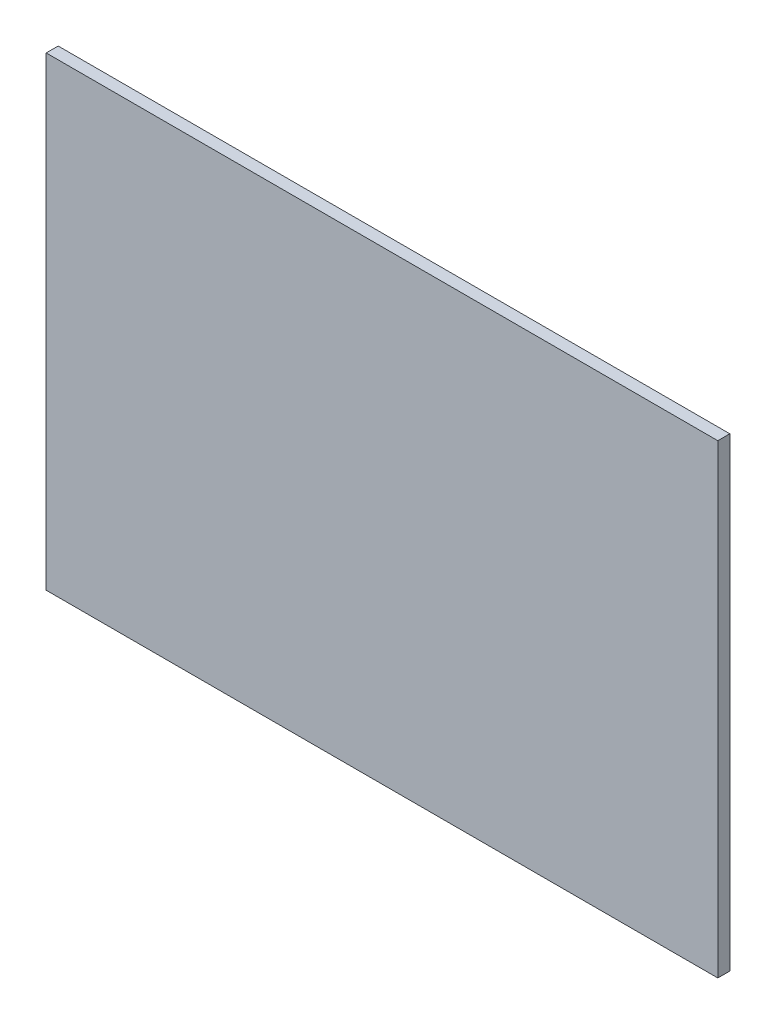
ISO-10303-21;
HEADER;
FILE_DESCRIPTION(('STEP AP214'),'2;1');
FILE_NAME('part.step','',(''),(''),'','','');
FILE_SCHEMA(('AUTOMOTIVE_DESIGN { 1 0 10303 214 1 1 1 1 }'));
ENDSEC;
DATA;
#1=APPLICATION_CONTEXT('core data for automotive mechanical design processes');
#2=APPLICATION_PROTOCOL_DEFINITION('international standard','automotive_design',2000,#1);
#3=PRODUCT_CONTEXT('',#1,'mechanical');
#4=PRODUCT('Part','Part','',(#3));
#5=PRODUCT_RELATED_PRODUCT_CATEGORY('part','',(#4));
#6=PRODUCT_DEFINITION_FORMATION('','',#4);
#7=PRODUCT_DEFINITION_CONTEXT('part definition',#1,'design');
#8=PRODUCT_DEFINITION('design','',#6,#7);
#9=PRODUCT_DEFINITION_SHAPE('','',#8);
#10=(LENGTH_UNIT() NAMED_UNIT(*) SI_UNIT(.MILLI.,.METRE.));
#11=(NAMED_UNIT(*) PLANE_ANGLE_UNIT() SI_UNIT($,.RADIAN.));
#12=(NAMED_UNIT(*) SI_UNIT($,.STERADIAN.) SOLID_ANGLE_UNIT());
#13=UNCERTAINTY_MEASURE_WITH_UNIT(LENGTH_MEASURE(1.E-05),#10,'distance_accuracy_value','');
#14=(GEOMETRIC_REPRESENTATION_CONTEXT(3) GLOBAL_UNCERTAINTY_ASSIGNED_CONTEXT((#13)) GLOBAL_UNIT_ASSIGNED_CONTEXT((#10,
#11,#12)) REPRESENTATION_CONTEXT('',''));
#15=CARTESIAN_POINT('',(0.,0.,0.));
#16=DIRECTION('',(0.,0.,1.));
#17=DIRECTION('',(1.,0.,0.));
#18=AXIS2_PLACEMENT_3D('',#15,#16,#17);
#19=CARTESIAN_POINT('',(0.,0.,3.175));
#20=DIRECTION('',(1.,0.,0.));
#21=DIRECTION('',(0.,0.,-1.));
#22=AXIS2_PLACEMENT_3D('',#19,#20,#21);
#23=PLANE('',#22);
#24=DIRECTION('',(0.,-1.,0.));
#25=VECTOR('',#24,1.);
#26=CARTESIAN_POINT('',(0.,0.,0.));
#27=LINE('',#26,#25);
#28=CARTESIAN_POINT('',(0.,123.19,0.));
#29=VERTEX_POINT('',#28);
#30=CARTESIAN_POINT('',(0.,0.,0.));
#31=VERTEX_POINT('',#30);
#32=EDGE_CURVE('E104',#29,#31,#27,.T.);
#33=ORIENTED_EDGE('',*,*,#32,.T.);
#34=DIRECTION('',(0.,0.,-1.));
#35=VECTOR('',#34,1.);
#36=CARTESIAN_POINT('',(0.,0.,3.175));
#37=LINE('',#36,#35);
#38=CARTESIAN_POINT('',(0.,0.,3.175));
#39=VERTEX_POINT('',#38);
#40=EDGE_CURVE('E11',#39,#31,#37,.T.);
#41=ORIENTED_EDGE('',*,*,#40,.F.);
#42=DIRECTION('',(0.,-1.,0.));
#43=VECTOR('',#42,1.);
#44=CARTESIAN_POINT('',(0.,0.,3.175));
#45=LINE('',#44,#43);
#46=CARTESIAN_POINT('',(0.,123.19,3.175));
#47=VERTEX_POINT('',#46);
#48=EDGE_CURVE('E92',#47,#39,#45,.T.);
#49=ORIENTED_EDGE('',*,*,#48,.F.);
#50=DIRECTION('',(0.,0.,-1.));
#51=VECTOR('',#50,1.);
#52=CARTESIAN_POINT('',(0.,123.19,3.175));
#53=LINE('',#52,#51);
#54=EDGE_CURVE('E100',#47,#29,#53,.T.);
#55=ORIENTED_EDGE('',*,*,#54,.T.);
#56=EDGE_LOOP('',(#33,#41,#49,#55));
#57=FACE_BOUND('',#56,.T.);
#58=ADVANCED_FACE('F41',(#57),#23,.F.);
#59=CARTESIAN_POINT('',(0.,0.,3.175));
#60=DIRECTION('',(0.,1.,0.));
#61=DIRECTION('',(0.,0.,1.));
#62=AXIS2_PLACEMENT_3D('',#59,#60,#61);
#63=PLANE('',#62);
#64=DIRECTION('',(1.,0.,0.));
#65=VECTOR('',#64,1.);
#66=CARTESIAN_POINT('',(0.,0.,0.));
#67=LINE('',#66,#65);
#68=CARTESIAN_POINT('',(177.8,0.,0.));
#69=VERTEX_POINT('',#68);
#70=EDGE_CURVE('E96',#31,#69,#67,.T.);
#71=ORIENTED_EDGE('',*,*,#70,.T.);
#72=DIRECTION('',(0.,0.,-1.));
#73=VECTOR('',#72,1.);
#74=CARTESIAN_POINT('',(177.8,0.,3.175));
#75=LINE('',#74,#73);
#76=CARTESIAN_POINT('',(177.8,0.,3.175));
#77=VERTEX_POINT('',#76);
#78=EDGE_CURVE('E49',#77,#69,#75,.T.);
#79=ORIENTED_EDGE('',*,*,#78,.F.);
#80=DIRECTION('',(1.,0.,0.));
#81=VECTOR('',#80,1.);
#82=CARTESIAN_POINT('',(0.,0.,3.175));
#83=LINE('',#82,#81);
#84=EDGE_CURVE('E87',#39,#77,#83,.T.);
#85=ORIENTED_EDGE('',*,*,#84,.F.);
#86=ORIENTED_EDGE('',*,*,#40,.T.);
#87=EDGE_LOOP('',(#71,#79,#85,#86));
#88=FACE_BOUND('',#87,.T.);
#89=ADVANCED_FACE('F95',(#88),#63,.F.);
#90=CARTESIAN_POINT('',(177.8,0.,3.175));
#91=DIRECTION('',(-1.,0.,0.));
#92=DIRECTION('',(0.,0.,1.));
#93=AXIS2_PLACEMENT_3D('',#90,#91,#92);
#94=PLANE('',#93);
#95=DIRECTION('',(0.,1.,0.));
#96=VECTOR('',#95,1.);
#97=CARTESIAN_POINT('',(177.8,0.,0.));
#98=LINE('',#97,#96);
#99=CARTESIAN_POINT('',(177.8,123.19,0.));
#100=VERTEX_POINT('',#99);
#101=EDGE_CURVE('E74',#69,#100,#98,.T.);
#102=ORIENTED_EDGE('',*,*,#101,.T.);
#103=DIRECTION('',(0.,0.,-1.));
#104=VECTOR('',#103,1.);
#105=CARTESIAN_POINT('',(177.8,123.19,3.175));
#106=LINE('',#105,#104);
#107=CARTESIAN_POINT('',(177.8,123.19,3.175));
#108=VERTEX_POINT('',#107);
#109=EDGE_CURVE('E97',#108,#100,#106,.T.);
#110=ORIENTED_EDGE('',*,*,#109,.F.);
#111=DIRECTION('',(0.,1.,0.));
#112=VECTOR('',#111,1.);
#113=CARTESIAN_POINT('',(177.8,0.,3.175));
#114=LINE('',#113,#112);
#115=EDGE_CURVE('E90',#77,#108,#114,.T.);
#116=ORIENTED_EDGE('',*,*,#115,.F.);
#117=ORIENTED_EDGE('',*,*,#78,.T.);
#118=EDGE_LOOP('',(#102,#110,#116,#117));
#119=FACE_BOUND('',#118,.T.);
#120=ADVANCED_FACE('F98',(#119),#94,.F.);
#121=CARTESIAN_POINT('',(0.,123.19,3.175));
#122=DIRECTION('',(0.,-1.,0.));
#123=DIRECTION('',(0.,0.,-1.));
#124=AXIS2_PLACEMENT_3D('',#121,#122,#123);
#125=PLANE('',#124);
#126=DIRECTION('',(-1.,0.,0.));
#127=VECTOR('',#126,1.);
#128=CARTESIAN_POINT('',(0.,123.19,0.));
#129=LINE('',#128,#127);
#130=EDGE_CURVE('E80',#100,#29,#129,.T.);
#131=ORIENTED_EDGE('',*,*,#130,.T.);
#132=ORIENTED_EDGE('',*,*,#54,.F.);
#133=DIRECTION('',(-1.,0.,0.));
#134=VECTOR('',#133,1.);
#135=CARTESIAN_POINT('',(0.,123.19,3.175));
#136=LINE('',#135,#134);
#137=EDGE_CURVE('E57',#108,#47,#136,.T.);
#138=ORIENTED_EDGE('',*,*,#137,.F.);
#139=ORIENTED_EDGE('',*,*,#109,.T.);
#140=EDGE_LOOP('',(#131,#132,#138,#139));
#141=FACE_BOUND('',#140,.T.);
#142=ADVANCED_FACE('F111',(#141),#125,.F.);
#143=CARTESIAN_POINT('',(0.,0.,3.175));
#144=DIRECTION('',(0.,0.,-1.));
#145=DIRECTION('',(-1.,0.,0.));
#146=AXIS2_PLACEMENT_3D('',#143,#144,#145);
#147=PLANE('',#146);
#148=ORIENTED_EDGE('',*,*,#48,.T.);
#149=ORIENTED_EDGE('',*,*,#84,.T.);
#150=ORIENTED_EDGE('',*,*,#115,.T.);
#151=ORIENTED_EDGE('',*,*,#137,.T.);
#152=EDGE_LOOP('',(#148,#149,#150,#151));
#153=FACE_BOUND('',#152,.T.);
#154=ADVANCED_FACE('F88',(#153),#147,.F.);
#155=CARTESIAN_POINT('',(0.,0.,0.));
#156=DIRECTION('',(0.,0.,-1.));
#157=DIRECTION('',(-1.,0.,0.));
#158=AXIS2_PLACEMENT_3D('',#155,#156,#157);
#159=PLANE('',#158);
#160=ORIENTED_EDGE('',*,*,#32,.F.);
#161=ORIENTED_EDGE('',*,*,#130,.F.);
#162=ORIENTED_EDGE('',*,*,#101,.F.);
#163=ORIENTED_EDGE('',*,*,#70,.F.);
#164=EDGE_LOOP('',(#160,#161,#162,#163));
#165=FACE_BOUND('',#164,.T.);
#166=ADVANCED_FACE('F114',(#165),#159,.T.);
#167=CLOSED_SHELL('',(#58,#89,#120,#142,#154,#166));
#168=MANIFOLD_SOLID_BREP('B2',#167);
#169=ADVANCED_BREP_SHAPE_REPRESENTATION('',(#18,#168),#14);
#170=SHAPE_DEFINITION_REPRESENTATION(#9,#169);
ENDSEC;
END-ISO-10303-21;
